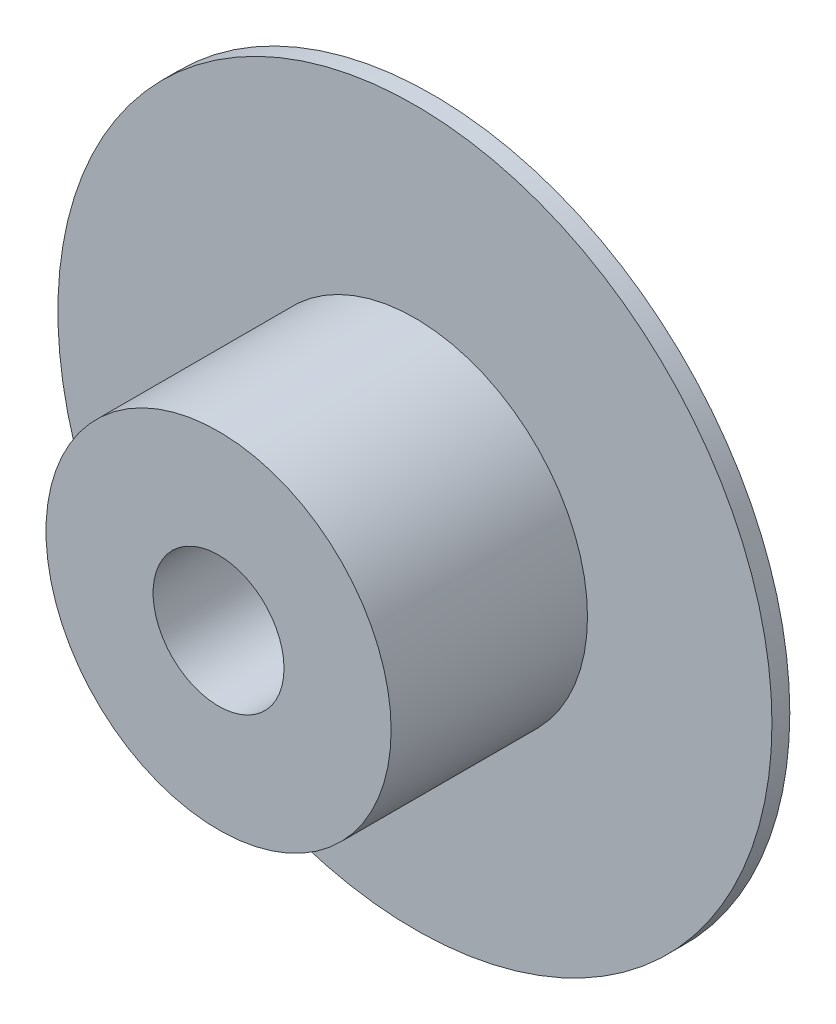
ISO-10303-21;
HEADER;
FILE_DESCRIPTION(('STEP AP214'),'2;1');
FILE_NAME('part.step','',(''),(''),'','','');
FILE_SCHEMA(('AUTOMOTIVE_DESIGN { 1 0 10303 214 1 1 1 1 }'));
ENDSEC;
DATA;
#1=APPLICATION_CONTEXT('core data for automotive mechanical design processes');
#2=APPLICATION_PROTOCOL_DEFINITION('international standard','automotive_design',2000,#1);
#3=PRODUCT_CONTEXT('',#1,'mechanical');
#4=PRODUCT('Part','Part','',(#3));
#5=PRODUCT_RELATED_PRODUCT_CATEGORY('part','',(#4));
#6=PRODUCT_DEFINITION_FORMATION('','',#4);
#7=PRODUCT_DEFINITION_CONTEXT('part definition',#1,'design');
#8=PRODUCT_DEFINITION('design','',#6,#7);
#9=PRODUCT_DEFINITION_SHAPE('','',#8);
#10=(LENGTH_UNIT() NAMED_UNIT(*) SI_UNIT(.MILLI.,.METRE.));
#11=(NAMED_UNIT(*) PLANE_ANGLE_UNIT() SI_UNIT($,.RADIAN.));
#12=(NAMED_UNIT(*) SI_UNIT($,.STERADIAN.) SOLID_ANGLE_UNIT());
#13=UNCERTAINTY_MEASURE_WITH_UNIT(LENGTH_MEASURE(1.E-05),#10,'distance_accuracy_value','');
#14=(GEOMETRIC_REPRESENTATION_CONTEXT(3) GLOBAL_UNCERTAINTY_ASSIGNED_CONTEXT((#13)) GLOBAL_UNIT_ASSIGNED_CONTEXT((#10,
#11,#12)) REPRESENTATION_CONTEXT('',''));
#15=CARTESIAN_POINT('',(0.,0.,0.));
#16=DIRECTION('',(0.,0.,1.));
#17=DIRECTION('',(1.,0.,0.));
#18=AXIS2_PLACEMENT_3D('',#15,#16,#17);
#19=CARTESIAN_POINT('',(0.,0.,1.5));
#20=DIRECTION('',(0.,0.,-1.));
#21=DIRECTION('',(-1.,0.,0.));
#22=AXIS2_PLACEMENT_3D('',#19,#20,#21);
#23=CYLINDRICAL_SURFACE('',#22,30.);
#24=CARTESIAN_POINT('',(0.,0.,1.5));
#25=DIRECTION('',(0.,0.,1.));
#26=DIRECTION('',(1.,0.,0.));
#27=AXIS2_PLACEMENT_3D('',#24,#25,#26);
#28=CIRCLE('',#27,30.);
#29=CARTESIAN_POINT('',(30.,0.,1.5));
#30=VERTEX_POINT('',#29);
#31=EDGE_CURVE('E54',#30,#30,#28,.T.);
#32=ORIENTED_EDGE('',*,*,#31,.F.);
#33=EDGE_LOOP('',(#32));
#34=FACE_BOUND('',#33,.T.);
#35=CARTESIAN_POINT('',(0.,0.,0.));
#36=DIRECTION('',(0.,0.,1.));
#37=DIRECTION('',(1.,0.,0.));
#38=AXIS2_PLACEMENT_3D('',#35,#36,#37);
#39=CIRCLE('',#38,30.);
#40=CARTESIAN_POINT('',(30.,0.,0.));
#41=VERTEX_POINT('',#40);
#42=EDGE_CURVE('E50',#41,#41,#39,.T.);
#43=ORIENTED_EDGE('',*,*,#42,.T.);
#44=EDGE_LOOP('',(#43));
#45=FACE_BOUND('',#44,.T.);
#46=ADVANCED_FACE('F47',(#34,#45),#23,.T.);
#47=CARTESIAN_POINT('',(0.,0.,1.5));
#48=DIRECTION('',(0.,0.,1.));
#49=DIRECTION('',(1.,0.,0.));
#50=AXIS2_PLACEMENT_3D('',#47,#48,#49);
#51=PLANE('',#50);
#52=CARTESIAN_POINT('',(0.,0.,1.5));
#53=DIRECTION('',(0.,0.,1.));
#54=DIRECTION('',(1.,0.,0.));
#55=AXIS2_PLACEMENT_3D('',#52,#53,#54);
#56=CIRCLE('',#55,14.5);
#57=CARTESIAN_POINT('',(14.5,0.,1.5));
#58=VERTEX_POINT('',#57);
#59=EDGE_CURVE('E63',#58,#58,#56,.F.);
#60=ORIENTED_EDGE('',*,*,#59,.T.);
#61=EDGE_LOOP('',(#60));
#62=FACE_BOUND('',#61,.T.);
#63=ORIENTED_EDGE('',*,*,#31,.T.);
#64=EDGE_LOOP('',(#63));
#65=FACE_BOUND('',#64,.T.);
#66=ADVANCED_FACE('F88',(#62,#65),#51,.T.);
#67=CARTESIAN_POINT('',(0.,0.,0.));
#68=DIRECTION('',(0.,0.,1.));
#69=DIRECTION('',(1.,0.,0.));
#70=AXIS2_PLACEMENT_3D('',#67,#68,#69);
#71=PLANE('',#70);
#72=ORIENTED_EDGE('',*,*,#42,.F.);
#73=EDGE_LOOP('',(#72));
#74=FACE_BOUND('',#73,.T.);
#75=ADVANCED_FACE('F80',(#74),#71,.F.);
#76=CARTESIAN_POINT('',(0.,0.,18.));
#77=DIRECTION('',(0.,0.,1.));
#78=DIRECTION('',(1.,0.,0.));
#79=AXIS2_PLACEMENT_3D('',#76,#77,#78);
#80=PLANE('',#79);
#81=CARTESIAN_POINT('',(0.,0.,18.));
#82=DIRECTION('',(0.,0.,1.));
#83=DIRECTION('',(1.,0.,0.));
#84=AXIS2_PLACEMENT_3D('',#81,#82,#83);
#85=CIRCLE('',#84,14.5);
#86=CARTESIAN_POINT('',(14.5,0.,18.));
#87=VERTEX_POINT('',#86);
#88=EDGE_CURVE('E61',#87,#87,#85,.T.);
#89=ORIENTED_EDGE('',*,*,#88,.T.);
#90=EDGE_LOOP('',(#89));
#91=FACE_BOUND('',#90,.T.);
#92=CARTESIAN_POINT('',(0.,0.,18.));
#93=DIRECTION('',(0.,0.,1.));
#94=DIRECTION('',(1.,0.,0.));
#95=AXIS2_PLACEMENT_3D('',#92,#93,#94);
#96=CIRCLE('',#95,5.5);
#97=CARTESIAN_POINT('',(5.5,0.,18.));
#98=VERTEX_POINT('',#97);
#99=EDGE_CURVE('E69',#98,#98,#96,.T.);
#100=ORIENTED_EDGE('',*,*,#99,.F.);
#101=EDGE_LOOP('',(#100));
#102=FACE_BOUND('',#101,.T.);
#103=ADVANCED_FACE('F77',(#91,#102),#80,.T.);
#104=CARTESIAN_POINT('',(0.,0.,18.));
#105=DIRECTION('',(0.,0.,-1.));
#106=DIRECTION('',(-1.,0.,0.));
#107=AXIS2_PLACEMENT_3D('',#104,#105,#106);
#108=CYLINDRICAL_SURFACE('',#107,14.5);
#109=ORIENTED_EDGE('',*,*,#59,.F.);
#110=EDGE_LOOP('',(#109));
#111=FACE_BOUND('',#110,.T.);
#112=ORIENTED_EDGE('',*,*,#88,.F.);
#113=EDGE_LOOP('',(#112));
#114=FACE_BOUND('',#113,.T.);
#115=ADVANCED_FACE('F79',(#111,#114),#108,.T.);
#116=CARTESIAN_POINT('',(0.,0.,18.));
#117=DIRECTION('',(0.,0.,-1.));
#118=DIRECTION('',(-1.,0.,0.));
#119=AXIS2_PLACEMENT_3D('',#116,#117,#118);
#120=CYLINDRICAL_SURFACE('',#119,5.5);
#121=CARTESIAN_POINT('',(0.,0.,1.5));
#122=DIRECTION('',(0.,0.,1.));
#123=DIRECTION('',(1.,0.,0.));
#124=AXIS2_PLACEMENT_3D('',#121,#122,#123);
#125=CIRCLE('',#124,5.5);
#126=CARTESIAN_POINT('',(5.5,0.,1.5));
#127=VERTEX_POINT('',#126);
#128=EDGE_CURVE('E11',#127,#127,#125,.F.);
#129=ORIENTED_EDGE('',*,*,#128,.T.);
#130=EDGE_LOOP('',(#129));
#131=FACE_BOUND('',#130,.T.);
#132=ORIENTED_EDGE('',*,*,#99,.T.);
#133=EDGE_LOOP('',(#132));
#134=FACE_BOUND('',#133,.T.);
#135=ADVANCED_FACE('F75',(#131,#134),#120,.F.);
#136=ORIENTED_EDGE('',*,*,#128,.F.);
#137=EDGE_LOOP('',(#136));
#138=FACE_BOUND('',#137,.T.);
#139=ADVANCED_FACE('F97',(#138),#51,.T.);
#140=CLOSED_SHELL('',(#46,#66,#75,#103,#115,#135,#139));
#141=MANIFOLD_SOLID_BREP('B2',#140);
#142=ADVANCED_BREP_SHAPE_REPRESENTATION('',(#18,#141),#14);
#143=SHAPE_DEFINITION_REPRESENTATION(#9,#142);
ENDSEC;
END-ISO-10303-21;
